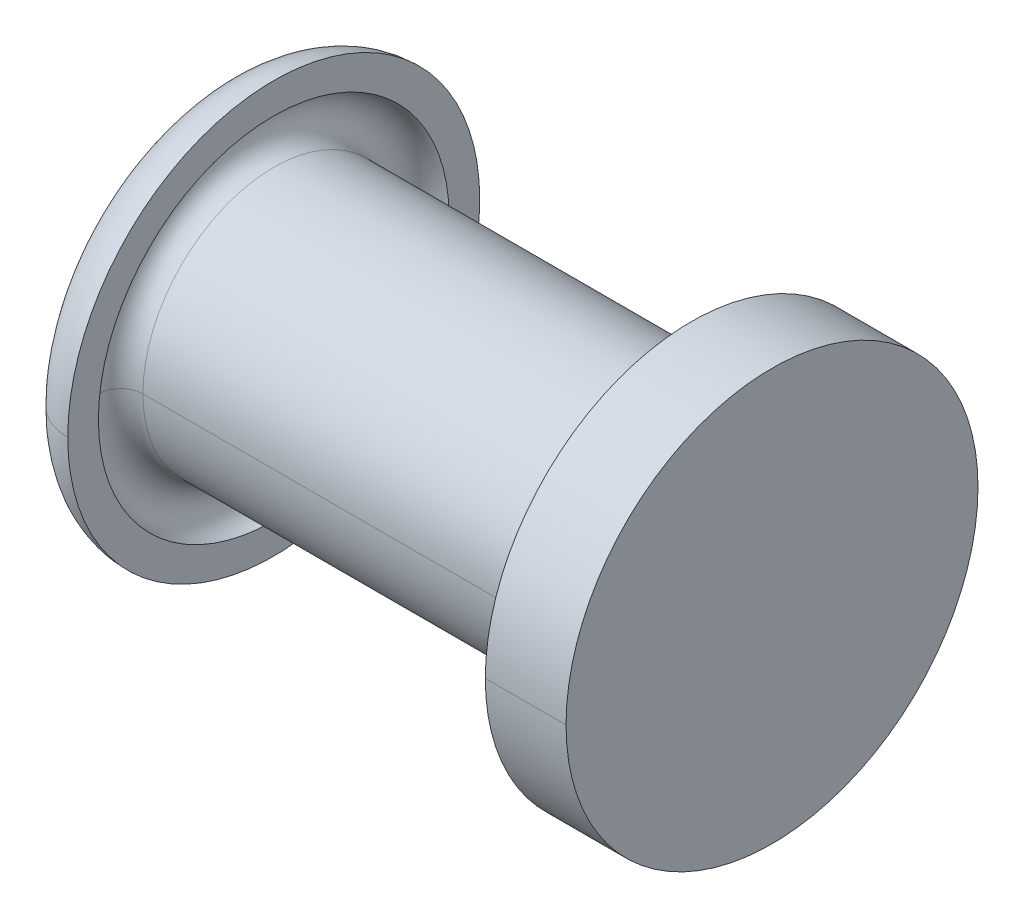
ISO-10303-21;
HEADER;
FILE_DESCRIPTION(('STEP AP214'),'2;1');
FILE_NAME('part.step','',(''),(''),'','','');
FILE_SCHEMA(('AUTOMOTIVE_DESIGN { 1 0 10303 214 1 1 1 1 }'));
ENDSEC;
DATA;
#1=APPLICATION_CONTEXT('core data for automotive mechanical design processes');
#2=APPLICATION_PROTOCOL_DEFINITION('international standard','automotive_design',2000,#1);
#3=PRODUCT_CONTEXT('',#1,'mechanical');
#4=PRODUCT('Part','Part','',(#3));
#5=PRODUCT_RELATED_PRODUCT_CATEGORY('part','',(#4));
#6=PRODUCT_DEFINITION_FORMATION('','',#4);
#7=PRODUCT_DEFINITION_CONTEXT('part definition',#1,'design');
#8=PRODUCT_DEFINITION('design','',#6,#7);
#9=PRODUCT_DEFINITION_SHAPE('','',#8);
#10=(LENGTH_UNIT() NAMED_UNIT(*) SI_UNIT(.MILLI.,.METRE.));
#11=(NAMED_UNIT(*) PLANE_ANGLE_UNIT() SI_UNIT($,.RADIAN.));
#12=(NAMED_UNIT(*) SI_UNIT($,.STERADIAN.) SOLID_ANGLE_UNIT());
#13=UNCERTAINTY_MEASURE_WITH_UNIT(LENGTH_MEASURE(1.E-05),#10,'distance_accuracy_value','');
#14=(GEOMETRIC_REPRESENTATION_CONTEXT(3) GLOBAL_UNCERTAINTY_ASSIGNED_CONTEXT((#13)) GLOBAL_UNIT_ASSIGNED_CONTEXT((#10,
#11,#12)) REPRESENTATION_CONTEXT('',''));
#15=CARTESIAN_POINT('',(0.,0.,0.));
#16=DIRECTION('',(0.,0.,1.));
#17=DIRECTION('',(1.,0.,0.));
#18=AXIS2_PLACEMENT_3D('',#15,#16,#17);
#19=CARTESIAN_POINT('',(-1.33017304996104,0.,0.));
#20=DIRECTION('',(-1.,0.,0.));
#21=DIRECTION('',(0.,0.,1.));
#22=AXIS2_PLACEMENT_3D('',#19,#20,#21);
#23=CONICAL_SURFACE('',#22,0.,1.02974425867665);
#24=DIRECTION('',(0.515038074910056,0.,-0.857167300702111));
#25=VECTOR('',#24,1.);
#26=CARTESIAN_POINT('',(-1.87959999999989,0.,0.914400000000071));
#27=LINE('',#26,#25);
#28=CARTESIAN_POINT('',(-1.87959999999994,0.,0.914400000000035));
#29=VERTEX_POINT('',#28);
#30=CARTESIAN_POINT('',(-1.33017304996104,0.,0.));
#31=VERTEX_POINT('',#30);
#32=EDGE_CURVE('E25',#29,#31,#27,.T.);
#33=ORIENTED_EDGE('',*,*,#32,.F.);
#34=CARTESIAN_POINT('',(-1.87959999999989,0.,0.));
#35=DIRECTION('',(-1.,0.,0.));
#36=DIRECTION('',(0.,0.,1.));
#37=AXIS2_PLACEMENT_3D('',#34,#35,#36);
#38=CIRCLE('',#37,0.914400000000071);
#39=CARTESIAN_POINT('',(-1.87959999999994,0.,-0.914400000000035));
#40=VERTEX_POINT('',#39);
#41=EDGE_CURVE('E20',#29,#40,#38,.T.);
#42=ORIENTED_EDGE('',*,*,#41,.T.);
#43=DIRECTION('',(0.515038074910056,0.,0.857167300702111));
#44=VECTOR('',#43,1.);
#45=CARTESIAN_POINT('',(-1.87959999999989,0.,-0.914400000000071));
#46=LINE('',#45,#44);
#47=EDGE_CURVE('E11',#40,#31,#46,.T.);
#48=ORIENTED_EDGE('',*,*,#47,.T.);
#49=EDGE_LOOP('',(#33,#42,#48));
#50=FACE_BOUND('',#49,.T.);
#51=ADVANCED_FACE('F17',(#50),#23,.F.);
#52=CARTESIAN_POINT('',(-1.33017304996104,0.,0.));
#53=DIRECTION('',(-1.,0.,0.));
#54=DIRECTION('',(0.,0.,1.));
#55=AXIS2_PLACEMENT_3D('',#52,#53,#54);
#56=CONICAL_SURFACE('',#55,0.,1.02974425867665);
#57=ORIENTED_EDGE('',*,*,#47,.F.);
#58=CARTESIAN_POINT('',(-1.87959999999989,0.,0.));
#59=DIRECTION('',(-1.,0.,0.));
#60=DIRECTION('',(0.,0.,-1.));
#61=AXIS2_PLACEMENT_3D('',#58,#59,#60);
#62=CIRCLE('',#61,0.914400000000071);
#63=EDGE_CURVE('E93',#40,#29,#62,.T.);
#64=ORIENTED_EDGE('',*,*,#63,.T.);
#65=ORIENTED_EDGE('',*,*,#32,.T.);
#66=EDGE_LOOP('',(#57,#64,#65));
#67=FACE_BOUND('',#66,.T.);
#68=ADVANCED_FACE('F92',(#67),#56,.F.);
#69=CARTESIAN_POINT('',(-1.905,0.,0.));
#70=DIRECTION('',(1.,0.,0.));
#71=DIRECTION('',(0.,0.,-1.));
#72=AXIS2_PLACEMENT_3D('',#69,#70,#71);
#73=TOROIDAL_SURFACE('',#72,1.397,0.4826);
#74=CARTESIAN_POINT('',(-1.905,0.,0.));
#75=DIRECTION('',(1.,0.,0.));
#76=DIRECTION('',(0.,0.,1.));
#77=AXIS2_PLACEMENT_3D('',#74,#75,#76);
#78=CIRCLE('',#77,0.9144);
#79=CARTESIAN_POINT('',(-1.90500000000001,0.,0.9144));
#80=VERTEX_POINT('',#79);
#81=CARTESIAN_POINT('',(-1.90500000000001,0.,-0.9144));
#82=VERTEX_POINT('',#81);
#83=EDGE_CURVE('E100',#80,#82,#78,.T.);
#84=ORIENTED_EDGE('',*,*,#83,.T.);
#85=CARTESIAN_POINT('',(-1.905,0.,-1.397));
#86=DIRECTION('',(0.,1.,0.));
#87=DIRECTION('',(0.,0.,-1.));
#88=AXIS2_PLACEMENT_3D('',#85,#86,#87);
#89=CIRCLE('',#88,0.4826);
#90=CARTESIAN_POINT('',(-1.905,0.,-1.8796));
#91=VERTEX_POINT('',#90);
#92=EDGE_CURVE('E112',#91,#82,#89,.T.);
#93=ORIENTED_EDGE('',*,*,#92,.F.);
#94=CARTESIAN_POINT('',(-1.905,0.,0.));
#95=DIRECTION('',(1.,0.,0.));
#96=DIRECTION('',(0.,0.,1.));
#97=AXIS2_PLACEMENT_3D('',#94,#95,#96);
#98=CIRCLE('',#97,1.8796);
#99=CARTESIAN_POINT('',(-1.905,0.,1.8796));
#100=VERTEX_POINT('',#99);
#101=EDGE_CURVE('E118',#100,#91,#98,.T.);
#102=ORIENTED_EDGE('',*,*,#101,.F.);
#103=CARTESIAN_POINT('',(-1.905,0.,1.397));
#104=DIRECTION('',(0.,-1.,0.));
#105=DIRECTION('',(0.,0.,1.));
#106=AXIS2_PLACEMENT_3D('',#103,#104,#105);
#107=CIRCLE('',#106,0.4826);
#108=EDGE_CURVE('E111',#100,#80,#107,.T.);
#109=ORIENTED_EDGE('',*,*,#108,.T.);
#110=EDGE_LOOP('',(#84,#93,#102,#109));
#111=FACE_BOUND('',#110,.T.);
#112=ADVANCED_FACE('F188',(#111),#73,.T.);
#113=CARTESIAN_POINT('',(33.1437784338811,0.,0.));
#114=DIRECTION('',(1.,0.,0.));
#115=DIRECTION('',(0.,0.,-1.));
#116=AXIS2_PLACEMENT_3D('',#113,#114,#115);
#117=CYLINDRICAL_SURFACE('',#116,0.9144);
#118=DIRECTION('',(-1.,0.,0.));
#119=VECTOR('',#118,1.);
#120=CARTESIAN_POINT('',(-1.87959999999999,0.,0.9144));
#121=LINE('',#120,#119);
#122=EDGE_CURVE('E89',#29,#80,#121,.T.);
#123=ORIENTED_EDGE('',*,*,#122,.F.);
#124=ORIENTED_EDGE('',*,*,#63,.F.);
#125=DIRECTION('',(-1.,0.,0.));
#126=VECTOR('',#125,1.);
#127=CARTESIAN_POINT('',(-1.87959999999999,0.,-0.9144));
#128=LINE('',#127,#126);
#129=EDGE_CURVE('E88',#40,#82,#128,.T.);
#130=ORIENTED_EDGE('',*,*,#129,.T.);
#131=ORIENTED_EDGE('',*,*,#83,.F.);
#132=EDGE_LOOP('',(#123,#124,#130,#131));
#133=FACE_BOUND('',#132,.T.);
#134=ADVANCED_FACE('F97',(#133),#117,.F.);
#135=CARTESIAN_POINT('',(33.1437784338811,0.,0.));
#136=DIRECTION('',(1.,0.,0.));
#137=DIRECTION('',(0.,0.,-1.));
#138=AXIS2_PLACEMENT_3D('',#135,#136,#137);
#139=CYLINDRICAL_SURFACE('',#138,0.9144);
#140=CARTESIAN_POINT('',(-1.905,0.,0.));
#141=DIRECTION('',(1.,0.,0.));
#142=DIRECTION('',(0.,0.,-1.));
#143=AXIS2_PLACEMENT_3D('',#140,#141,#142);
#144=CIRCLE('',#143,0.9144);
#145=EDGE_CURVE('E104',#82,#80,#144,.T.);
#146=ORIENTED_EDGE('',*,*,#145,.F.);
#147=ORIENTED_EDGE('',*,*,#129,.F.);
#148=ORIENTED_EDGE('',*,*,#41,.F.);
#149=ORIENTED_EDGE('',*,*,#122,.T.);
#150=EDGE_LOOP('',(#146,#147,#148,#149));
#151=FACE_BOUND('',#150,.T.);
#152=ADVANCED_FACE('F102',(#151),#139,.F.);
#153=CARTESIAN_POINT('',(-1.905,0.,0.));
#154=DIRECTION('',(1.,0.,0.));
#155=DIRECTION('',(0.,0.,-1.));
#156=AXIS2_PLACEMENT_3D('',#153,#154,#155);
#157=TOROIDAL_SURFACE('',#156,1.397,0.4826);
#158=ORIENTED_EDGE('',*,*,#108,.F.);
#159=CARTESIAN_POINT('',(-1.905,0.,0.));
#160=DIRECTION('',(1.,0.,0.));
#161=DIRECTION('',(0.,0.,-1.));
#162=AXIS2_PLACEMENT_3D('',#159,#160,#161);
#163=CIRCLE('',#162,1.8796);
#164=EDGE_CURVE('E123',#91,#100,#163,.T.);
#165=ORIENTED_EDGE('',*,*,#164,.F.);
#166=ORIENTED_EDGE('',*,*,#92,.T.);
#167=ORIENTED_EDGE('',*,*,#145,.T.);
#168=EDGE_LOOP('',(#158,#165,#166,#167));
#169=FACE_BOUND('',#168,.T.);
#170=ADVANCED_FACE('F198',(#169),#157,.T.);
#171=CARTESIAN_POINT('',(-1.905,-1.6002,0.));
#172=DIRECTION('',(-1.,0.,0.));
#173=DIRECTION('',(0.,0.,1.));
#174=AXIS2_PLACEMENT_3D('',#171,#172,#173);
#175=PLANE('',#174);
#176=CARTESIAN_POINT('',(-1.905,0.,0.));
#177=DIRECTION('',(-1.,0.,0.));
#178=DIRECTION('',(0.,0.,-1.));
#179=AXIS2_PLACEMENT_3D('',#176,#177,#178);
#180=CIRCLE('',#179,1.6002);
#181=CARTESIAN_POINT('',(-1.905,0.,-1.6002));
#182=VERTEX_POINT('',#181);
#183=CARTESIAN_POINT('',(-1.905,0.,1.6002));
#184=VERTEX_POINT('',#183);
#185=EDGE_CURVE('E121',#182,#184,#180,.T.);
#186=ORIENTED_EDGE('',*,*,#185,.T.);
#187=CARTESIAN_POINT('',(-1.905,0.,0.));
#188=DIRECTION('',(-1.,0.,0.));
#189=DIRECTION('',(0.,0.,1.));
#190=AXIS2_PLACEMENT_3D('',#187,#188,#189);
#191=CIRCLE('',#190,1.6002);
#192=EDGE_CURVE('E125',#184,#182,#191,.T.);
#193=ORIENTED_EDGE('',*,*,#192,.T.);
#194=EDGE_LOOP('',(#186,#193));
#195=FACE_BOUND('',#194,.T.);
#196=ORIENTED_EDGE('',*,*,#101,.T.);
#197=ORIENTED_EDGE('',*,*,#164,.T.);
#198=EDGE_LOOP('',(#196,#197));
#199=FACE_BOUND('',#198,.T.);
#200=ADVANCED_FACE('F201',(#195,#199),#175,.F.);
#201=CARTESIAN_POINT('',(33.1437784338811,0.,0.));
#202=DIRECTION('',(1.,0.,0.));
#203=DIRECTION('',(0.,0.,-1.));
#204=AXIS2_PLACEMENT_3D('',#201,#202,#203);
#205=CYLINDRICAL_SURFACE('',#204,1.1938);
#206=CARTESIAN_POINT('',(-1.905,0.,0.));
#207=DIRECTION('',(-1.,0.,0.));
#208=DIRECTION('',(0.,0.,-1.));
#209=AXIS2_PLACEMENT_3D('',#206,#207,#208);
#210=CIRCLE('',#209,1.1938);
#211=CARTESIAN_POINT('',(-1.90500000000001,0.,-1.1938));
#212=VERTEX_POINT('',#211);
#213=CARTESIAN_POINT('',(-1.90500000000001,0.,1.1938));
#214=VERTEX_POINT('',#213);
#215=EDGE_CURVE('E124',#212,#214,#210,.T.);
#216=ORIENTED_EDGE('',*,*,#215,.F.);
#217=DIRECTION('',(-1.,0.,0.));
#218=VECTOR('',#217,1.);
#219=CARTESIAN_POINT('',(1.90499999999998,0.,-1.1938));
#220=LINE('',#219,#218);
#221=CARTESIAN_POINT('',(1.90499999999998,0.,-1.1938));
#222=VERTEX_POINT('',#221);
#223=EDGE_CURVE('E135',#222,#212,#220,.T.);
#224=ORIENTED_EDGE('',*,*,#223,.F.);
#225=CARTESIAN_POINT('',(1.90499999999999,0.,0.));
#226=DIRECTION('',(1.,0.,0.));
#227=DIRECTION('',(0.,0.,1.));
#228=AXIS2_PLACEMENT_3D('',#225,#226,#227);
#229=CIRCLE('',#228,1.1938);
#230=CARTESIAN_POINT('',(1.90499999999998,0.,1.1938));
#231=VERTEX_POINT('',#230);
#232=EDGE_CURVE('E143',#231,#222,#229,.T.);
#233=ORIENTED_EDGE('',*,*,#232,.F.);
#234=DIRECTION('',(-1.,0.,0.));
#235=VECTOR('',#234,1.);
#236=CARTESIAN_POINT('',(1.90499999999998,0.,1.1938));
#237=LINE('',#236,#235);
#238=EDGE_CURVE('E133',#231,#214,#237,.T.);
#239=ORIENTED_EDGE('',*,*,#238,.T.);
#240=EDGE_LOOP('',(#216,#224,#233,#239));
#241=FACE_BOUND('',#240,.T.);
#242=ADVANCED_FACE('F204',(#241),#205,.T.);
#243=CARTESIAN_POINT('',(-1.905,0.,0.));
#244=DIRECTION('',(1.,0.,0.));
#245=DIRECTION('',(0.,0.,-1.));
#246=AXIS2_PLACEMENT_3D('',#243,#244,#245);
#247=TOROIDAL_SURFACE('',#246,1.397,0.2032);
#248=CARTESIAN_POINT('',(-1.905,0.,1.397));
#249=DIRECTION('',(0.,-1.,0.));
#250=DIRECTION('',(0.,0.,1.));
#251=AXIS2_PLACEMENT_3D('',#248,#249,#250);
#252=CIRCLE('',#251,0.2032);
#253=EDGE_CURVE('E128',#184,#214,#252,.T.);
#254=ORIENTED_EDGE('',*,*,#253,.F.);
#255=ORIENTED_EDGE('',*,*,#185,.F.);
#256=CARTESIAN_POINT('',(-1.905,0.,-1.397));
#257=DIRECTION('',(0.,1.,0.));
#258=DIRECTION('',(0.,0.,-1.));
#259=AXIS2_PLACEMENT_3D('',#256,#257,#258);
#260=CIRCLE('',#259,0.2032);
#261=EDGE_CURVE('E127',#182,#212,#260,.T.);
#262=ORIENTED_EDGE('',*,*,#261,.T.);
#263=ORIENTED_EDGE('',*,*,#215,.T.);
#264=EDGE_LOOP('',(#254,#255,#262,#263));
#265=FACE_BOUND('',#264,.T.);
#266=ADVANCED_FACE('F208',(#265),#247,.F.);
#267=CARTESIAN_POINT('',(-1.905,0.,0.));
#268=DIRECTION('',(1.,0.,0.));
#269=DIRECTION('',(0.,0.,-1.));
#270=AXIS2_PLACEMENT_3D('',#267,#268,#269);
#271=TOROIDAL_SURFACE('',#270,1.397,0.2032);
#272=CARTESIAN_POINT('',(-1.905,0.,0.));
#273=DIRECTION('',(-1.,0.,0.));
#274=DIRECTION('',(0.,0.,1.));
#275=AXIS2_PLACEMENT_3D('',#272,#273,#274);
#276=CIRCLE('',#275,1.1938);
#277=EDGE_CURVE('E140',#214,#212,#276,.T.);
#278=ORIENTED_EDGE('',*,*,#277,.T.);
#279=ORIENTED_EDGE('',*,*,#261,.F.);
#280=ORIENTED_EDGE('',*,*,#192,.F.);
#281=ORIENTED_EDGE('',*,*,#253,.T.);
#282=EDGE_LOOP('',(#278,#279,#280,#281));
#283=FACE_BOUND('',#282,.T.);
#284=ADVANCED_FACE('F212',(#283),#271,.F.);
#285=CARTESIAN_POINT('',(33.1437784338811,0.,0.));
#286=DIRECTION('',(1.,0.,0.));
#287=DIRECTION('',(0.,0.,-1.));
#288=AXIS2_PLACEMENT_3D('',#285,#286,#287);
#289=CYLINDRICAL_SURFACE('',#288,1.1938);
#290=ORIENTED_EDGE('',*,*,#238,.F.);
#291=CARTESIAN_POINT('',(1.90499999999999,0.,0.));
#292=DIRECTION('',(1.,0.,0.));
#293=DIRECTION('',(0.,0.,-1.));
#294=AXIS2_PLACEMENT_3D('',#291,#292,#293);
#295=CIRCLE('',#294,1.1938);
#296=EDGE_CURVE('E153',#222,#231,#295,.T.);
#297=ORIENTED_EDGE('',*,*,#296,.F.);
#298=ORIENTED_EDGE('',*,*,#223,.T.);
#299=ORIENTED_EDGE('',*,*,#277,.F.);
#300=EDGE_LOOP('',(#290,#297,#298,#299));
#301=FACE_BOUND('',#300,.T.);
#302=ADVANCED_FACE('F182',(#301),#289,.T.);
#303=CARTESIAN_POINT('',(33.1437784338811,0.,0.));
#304=DIRECTION('',(1.,0.,0.));
#305=DIRECTION('',(0.,0.,-1.));
#306=AXIS2_PLACEMENT_3D('',#303,#304,#305);
#307=CYLINDRICAL_SURFACE('',#306,1.8796);
#308=CARTESIAN_POINT('',(1.90499999999998,0.,0.));
#309=DIRECTION('',(-1.,0.,0.));
#310=DIRECTION('',(0.,0.,-1.));
#311=AXIS2_PLACEMENT_3D('',#308,#309,#310);
#312=CIRCLE('',#311,1.8796);
#313=CARTESIAN_POINT('',(1.90499999999998,0.,-1.8796));
#314=VERTEX_POINT('',#313);
#315=CARTESIAN_POINT('',(1.90499999999998,0.,1.8796));
#316=VERTEX_POINT('',#315);
#317=EDGE_CURVE('E150',#314,#316,#312,.T.);
#318=ORIENTED_EDGE('',*,*,#317,.F.);
#319=DIRECTION('',(-1.,0.,0.));
#320=VECTOR('',#319,1.);
#321=CARTESIAN_POINT('',(2.6416,0.,-1.8796));
#322=LINE('',#321,#320);
#323=CARTESIAN_POINT('',(2.6416,0.,-1.8796));
#324=VERTEX_POINT('',#323);
#325=EDGE_CURVE('E37',#324,#314,#322,.T.);
#326=ORIENTED_EDGE('',*,*,#325,.F.);
#327=CARTESIAN_POINT('',(2.6416,0.,0.));
#328=DIRECTION('',(1.,0.,0.));
#329=DIRECTION('',(0.,0.,1.));
#330=AXIS2_PLACEMENT_3D('',#327,#328,#329);
#331=CIRCLE('',#330,1.8796);
#332=CARTESIAN_POINT('',(2.6416,0.,1.8796));
#333=VERTEX_POINT('',#332);
#334=EDGE_CURVE('E32',#333,#324,#331,.T.);
#335=ORIENTED_EDGE('',*,*,#334,.F.);
#336=DIRECTION('',(-1.,0.,0.));
#337=VECTOR('',#336,1.);
#338=CARTESIAN_POINT('',(2.6416,0.,1.8796));
#339=LINE('',#338,#337);
#340=EDGE_CURVE('E148',#333,#316,#339,.T.);
#341=ORIENTED_EDGE('',*,*,#340,.T.);
#342=EDGE_LOOP('',(#318,#326,#335,#341));
#343=FACE_BOUND('',#342,.T.);
#344=ADVANCED_FACE('F170',(#343),#307,.T.);
#345=CARTESIAN_POINT('',(1.905,-1.8796,0.));
#346=DIRECTION('',(1.,0.,0.));
#347=DIRECTION('',(0.,0.,-1.));
#348=AXIS2_PLACEMENT_3D('',#345,#346,#347);
#349=PLANE('',#348);
#350=ORIENTED_EDGE('',*,*,#232,.T.);
#351=ORIENTED_EDGE('',*,*,#296,.T.);
#352=EDGE_LOOP('',(#350,#351));
#353=FACE_BOUND('',#352,.T.);
#354=ORIENTED_EDGE('',*,*,#317,.T.);
#355=CARTESIAN_POINT('',(1.90499999999998,0.,0.));
#356=DIRECTION('',(-1.,0.,0.));
#357=DIRECTION('',(0.,0.,1.));
#358=AXIS2_PLACEMENT_3D('',#355,#356,#357);
#359=CIRCLE('',#358,1.8796);
#360=EDGE_CURVE('E158',#316,#314,#359,.T.);
#361=ORIENTED_EDGE('',*,*,#360,.T.);
#362=EDGE_LOOP('',(#354,#361));
#363=FACE_BOUND('',#362,.T.);
#364=ADVANCED_FACE('F172',(#353,#363),#349,.F.);
#365=CARTESIAN_POINT('',(33.1437784338811,0.,0.));
#366=DIRECTION('',(1.,0.,0.));
#367=DIRECTION('',(0.,0.,-1.));
#368=AXIS2_PLACEMENT_3D('',#365,#366,#367);
#369=CYLINDRICAL_SURFACE('',#368,1.8796);
#370=ORIENTED_EDGE('',*,*,#340,.F.);
#371=CARTESIAN_POINT('',(2.6416,0.,0.));
#372=DIRECTION('',(1.,0.,0.));
#373=DIRECTION('',(0.,0.,-1.));
#374=AXIS2_PLACEMENT_3D('',#371,#372,#373);
#375=CIRCLE('',#374,1.8796);
#376=EDGE_CURVE('E163',#324,#333,#375,.T.);
#377=ORIENTED_EDGE('',*,*,#376,.F.);
#378=ORIENTED_EDGE('',*,*,#325,.T.);
#379=ORIENTED_EDGE('',*,*,#360,.F.);
#380=EDGE_LOOP('',(#370,#377,#378,#379));
#381=FACE_BOUND('',#380,.T.);
#382=ADVANCED_FACE('F168',(#381),#369,.T.);
#383=CARTESIAN_POINT('',(2.6416,0.,0.));
#384=DIRECTION('',(-1.,0.,0.));
#385=DIRECTION('',(0.,0.,1.));
#386=AXIS2_PLACEMENT_3D('',#383,#384,#385);
#387=PLANE('',#386);
#388=ORIENTED_EDGE('',*,*,#334,.T.);
#389=ORIENTED_EDGE('',*,*,#376,.T.);
#390=EDGE_LOOP('',(#388,#389));
#391=FACE_BOUND('',#390,.T.);
#392=ADVANCED_FACE('F166',(#391),#387,.F.);
#393=CLOSED_SHELL('',(#51,#68,#112,#134,#152,#170,#200,#242,#266,#284,#302,#344,#364,#382,#392));
#394=MANIFOLD_SOLID_BREP('B1',#393);
#395=ADVANCED_BREP_SHAPE_REPRESENTATION('',(#18,#394),#14);
#396=SHAPE_DEFINITION_REPRESENTATION(#9,#395);
ENDSEC;
END-ISO-10303-21;
